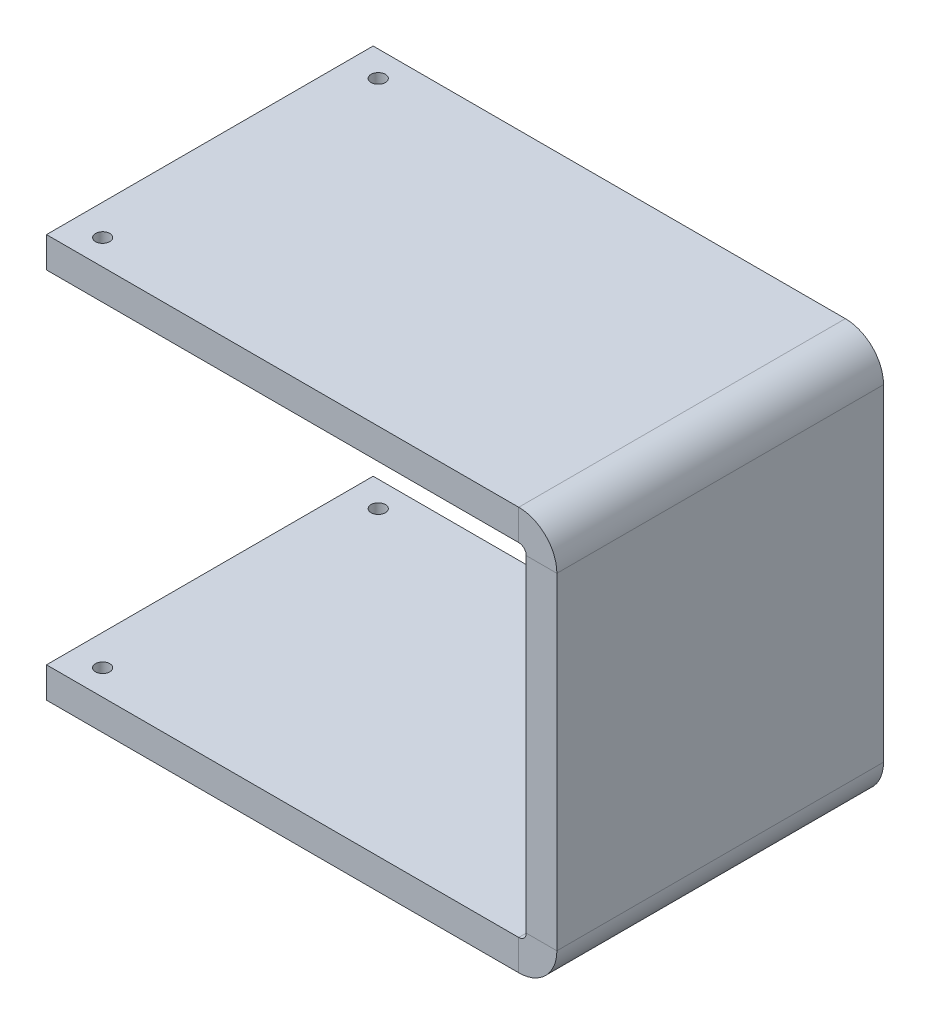
ISO-10303-21;
HEADER;
FILE_DESCRIPTION(('STEP AP214'),'2;1');
FILE_NAME('part.step','',(''),(''),'','','');
FILE_SCHEMA(('AUTOMOTIVE_DESIGN { 1 0 10303 214 1 1 1 1 }'));
ENDSEC;
DATA;
#1=APPLICATION_CONTEXT('core data for automotive mechanical design processes');
#2=APPLICATION_PROTOCOL_DEFINITION('international standard','automotive_design',2000,#1);
#3=PRODUCT_CONTEXT('',#1,'mechanical');
#4=PRODUCT('Part','Part','',(#3));
#5=PRODUCT_RELATED_PRODUCT_CATEGORY('part','',(#4));
#6=PRODUCT_DEFINITION_FORMATION('','',#4);
#7=PRODUCT_DEFINITION_CONTEXT('part definition',#1,'design');
#8=PRODUCT_DEFINITION('design','',#6,#7);
#9=PRODUCT_DEFINITION_SHAPE('','',#8);
#10=(LENGTH_UNIT() NAMED_UNIT(*) SI_UNIT(.MILLI.,.METRE.));
#11=(NAMED_UNIT(*) PLANE_ANGLE_UNIT() SI_UNIT($,.RADIAN.));
#12=(NAMED_UNIT(*) SI_UNIT($,.STERADIAN.) SOLID_ANGLE_UNIT());
#13=UNCERTAINTY_MEASURE_WITH_UNIT(LENGTH_MEASURE(1.E-05),#10,'distance_accuracy_value','');
#14=(GEOMETRIC_REPRESENTATION_CONTEXT(3) GLOBAL_UNCERTAINTY_ASSIGNED_CONTEXT((#13)) GLOBAL_UNIT_ASSIGNED_CONTEXT((#10,
#11,#12)) REPRESENTATION_CONTEXT('',''));
#15=CARTESIAN_POINT('',(0.,0.,0.));
#16=DIRECTION('',(0.,0.,1.));
#17=DIRECTION('',(1.,0.,0.));
#18=AXIS2_PLACEMENT_3D('',#15,#16,#17);
#19=CARTESIAN_POINT('',(0.,16.0134,32.));
#20=DIRECTION('',(0.,0.,1.));
#21=DIRECTION('',(1.,0.,0.));
#22=AXIS2_PLACEMENT_3D('',#19,#20,#21);
#23=PLANE('',#22);
#24=DIRECTION('',(-1.,0.,0.));
#25=VECTOR('',#24,1.);
#26=CARTESIAN_POINT('',(0.,16.0134,32.));
#27=LINE('',#26,#25);
#28=CARTESIAN_POINT('',(0.,16.0134,32.));
#29=VERTEX_POINT('',#28);
#30=CARTESIAN_POINT('',(-3.,16.0134,32.));
#31=VERTEX_POINT('',#30);
#32=EDGE_CURVE('E11',#29,#31,#27,.T.);
#33=ORIENTED_EDGE('',*,*,#32,.F.);
#34=CARTESIAN_POINT('',(-3.73659999999999,16.0134,32.));
#35=DIRECTION('',(0.,0.,1.));
#36=DIRECTION('',(1.,0.,0.));
#37=AXIS2_PLACEMENT_3D('',#34,#35,#36);
#38=CIRCLE('',#37,3.7366);
#39=CARTESIAN_POINT('',(-3.73659999999999,19.75,32.));
#40=VERTEX_POINT('',#39);
#41=EDGE_CURVE('E273',#40,#29,#38,.F.);
#42=ORIENTED_EDGE('',*,*,#41,.F.);
#43=DIRECTION('',(0.,1.,0.));
#44=VECTOR('',#43,1.);
#45=CARTESIAN_POINT('',(-3.73659999999999,16.75,32.));
#46=LINE('',#45,#44);
#47=CARTESIAN_POINT('',(-3.73659999999999,16.75,32.));
#48=VERTEX_POINT('',#47);
#49=EDGE_CURVE('E46',#48,#40,#46,.T.);
#50=ORIENTED_EDGE('',*,*,#49,.F.);
#51=CARTESIAN_POINT('',(-3.73659999999999,16.0134,32.));
#52=DIRECTION('',(0.,0.,1.));
#53=DIRECTION('',(1.,0.,0.));
#54=AXIS2_PLACEMENT_3D('',#51,#52,#53);
#55=CIRCLE('',#54,0.7366);
#56=EDGE_CURVE('E148',#48,#31,#55,.F.);
#57=ORIENTED_EDGE('',*,*,#56,.T.);
#58=EDGE_LOOP('',(#33,#42,#50,#57));
#59=FACE_BOUND('',#58,.T.);
#60=ADVANCED_FACE('F37',(#59),#23,.T.);
#61=CARTESIAN_POINT('',(-3.73659999999999,16.75,32.));
#62=DIRECTION('',(0.,0.,1.));
#63=DIRECTION('',(1.,0.,0.));
#64=AXIS2_PLACEMENT_3D('',#61,#62,#63);
#65=PLANE('',#64);
#66=DIRECTION('',(0.,-1.,0.));
#67=VECTOR('',#66,1.);
#68=CARTESIAN_POINT('',(0.,19.75,32.));
#69=LINE('',#68,#67);
#70=CARTESIAN_POINT('',(0.,-16.0134,32.));
#71=VERTEX_POINT('',#70);
#72=EDGE_CURVE('E142',#29,#71,#69,.T.);
#73=ORIENTED_EDGE('',*,*,#72,.F.);
#74=ORIENTED_EDGE('',*,*,#32,.T.);
#75=DIRECTION('',(0.,1.,0.));
#76=VECTOR('',#75,1.);
#77=CARTESIAN_POINT('',(-3.,19.75,32.));
#78=LINE('',#77,#76);
#79=CARTESIAN_POINT('',(-3.,-16.0134,32.));
#80=VERTEX_POINT('',#79);
#81=EDGE_CURVE('E139',#31,#80,#78,.F.);
#82=ORIENTED_EDGE('',*,*,#81,.T.);
#83=DIRECTION('',(1.,0.,0.));
#84=VECTOR('',#83,1.);
#85=CARTESIAN_POINT('',(-3.,-16.0134,32.));
#86=LINE('',#85,#84);
#87=EDGE_CURVE('E231',#80,#71,#86,.T.);
#88=ORIENTED_EDGE('',*,*,#87,.T.);
#89=EDGE_LOOP('',(#73,#74,#82,#88));
#90=FACE_BOUND('',#89,.T.);
#91=ADVANCED_FACE('F137',(#90),#65,.T.);
#92=CARTESIAN_POINT('',(-3.73659999999999,19.75,0.));
#93=DIRECTION('',(0.,0.,-1.));
#94=DIRECTION('',(-1.,0.,0.));
#95=AXIS2_PLACEMENT_3D('',#92,#93,#94);
#96=PLANE('',#95);
#97=DIRECTION('',(0.,-1.,0.));
#98=VECTOR('',#97,1.);
#99=CARTESIAN_POINT('',(-3.73659999999999,19.75,0.));
#100=LINE('',#99,#98);
#101=CARTESIAN_POINT('',(-3.73659999999999,19.75,0.));
#102=VERTEX_POINT('',#101);
#103=CARTESIAN_POINT('',(-3.73659999999999,16.75,0.));
#104=VERTEX_POINT('',#103);
#105=EDGE_CURVE('E236',#102,#104,#100,.T.);
#106=ORIENTED_EDGE('',*,*,#105,.F.);
#107=CARTESIAN_POINT('',(-3.73659999999999,16.0134,0.));
#108=DIRECTION('',(0.,0.,1.));
#109=DIRECTION('',(1.,0.,0.));
#110=AXIS2_PLACEMENT_3D('',#107,#108,#109);
#111=CIRCLE('',#110,3.7366);
#112=CARTESIAN_POINT('',(0.,16.0134,0.));
#113=VERTEX_POINT('',#112);
#114=EDGE_CURVE('E188',#102,#113,#111,.F.);
#115=ORIENTED_EDGE('',*,*,#114,.T.);
#116=DIRECTION('',(1.,0.,0.));
#117=VECTOR('',#116,1.);
#118=CARTESIAN_POINT('',(-3.,16.0134,0.));
#119=LINE('',#118,#117);
#120=CARTESIAN_POINT('',(-3.,16.0134,0.));
#121=VERTEX_POINT('',#120);
#122=EDGE_CURVE('E234',#121,#113,#119,.T.);
#123=ORIENTED_EDGE('',*,*,#122,.F.);
#124=CARTESIAN_POINT('',(-3.73659999999999,16.0134,0.));
#125=DIRECTION('',(0.,0.,1.));
#126=DIRECTION('',(1.,0.,0.));
#127=AXIS2_PLACEMENT_3D('',#124,#125,#126);
#128=CIRCLE('',#127,0.7366);
#129=EDGE_CURVE('E160',#104,#121,#128,.F.);
#130=ORIENTED_EDGE('',*,*,#129,.F.);
#131=EDGE_LOOP('',(#106,#115,#123,#130));
#132=FACE_BOUND('',#131,.T.);
#133=ADVANCED_FACE('F291',(#132),#96,.T.);
#134=CARTESIAN_POINT('',(-3.,16.0134,0.));
#135=DIRECTION('',(0.,0.,-1.));
#136=DIRECTION('',(-1.,0.,0.));
#137=AXIS2_PLACEMENT_3D('',#134,#135,#136);
#138=PLANE('',#137);
#139=DIRECTION('',(1.,0.,0.));
#140=VECTOR('',#139,1.);
#141=CARTESIAN_POINT('',(-50.,19.75,0.));
#142=LINE('',#141,#140);
#143=CARTESIAN_POINT('',(-50.,19.75,0.));
#144=VERTEX_POINT('',#143);
#145=EDGE_CURVE('E191',#144,#102,#142,.T.);
#146=ORIENTED_EDGE('',*,*,#145,.T.);
#147=ORIENTED_EDGE('',*,*,#105,.T.);
#148=DIRECTION('',(1.,0.,0.));
#149=VECTOR('',#148,1.);
#150=CARTESIAN_POINT('',(-50.,16.75,0.));
#151=LINE('',#150,#149);
#152=CARTESIAN_POINT('',(-50.,16.75,0.));
#153=VERTEX_POINT('',#152);
#154=EDGE_CURVE('E197',#153,#104,#151,.T.);
#155=ORIENTED_EDGE('',*,*,#154,.F.);
#156=DIRECTION('',(0.,1.,0.));
#157=VECTOR('',#156,1.);
#158=CARTESIAN_POINT('',(-50.,16.75,0.));
#159=LINE('',#158,#157);
#160=EDGE_CURVE('E194',#153,#144,#159,.T.);
#161=ORIENTED_EDGE('',*,*,#160,.T.);
#162=EDGE_LOOP('',(#146,#147,#155,#161));
#163=FACE_BOUND('',#162,.T.);
#164=ADVANCED_FACE('F337',(#163),#138,.T.);
#165=CARTESIAN_POINT('',(-3.7366,-19.75,32.));
#166=DIRECTION('',(0.,0.,1.));
#167=DIRECTION('',(1.,0.,0.));
#168=AXIS2_PLACEMENT_3D('',#165,#166,#167);
#169=PLANE('',#168);
#170=DIRECTION('',(0.,1.,0.));
#171=VECTOR('',#170,1.);
#172=CARTESIAN_POINT('',(-3.7366,-19.75,32.));
#173=LINE('',#172,#171);
#174=CARTESIAN_POINT('',(-3.7366,-19.75,32.));
#175=VERTEX_POINT('',#174);
#176=CARTESIAN_POINT('',(-3.7366,-16.75,32.));
#177=VERTEX_POINT('',#176);
#178=EDGE_CURVE('E55',#175,#177,#173,.T.);
#179=ORIENTED_EDGE('',*,*,#178,.F.);
#180=CARTESIAN_POINT('',(-3.7366,-16.0134,32.));
#181=DIRECTION('',(0.,0.,1.));
#182=DIRECTION('',(1.,0.,0.));
#183=AXIS2_PLACEMENT_3D('',#180,#181,#182);
#184=CIRCLE('',#183,3.7366);
#185=EDGE_CURVE('E269',#71,#175,#184,.F.);
#186=ORIENTED_EDGE('',*,*,#185,.F.);
#187=ORIENTED_EDGE('',*,*,#87,.F.);
#188=CARTESIAN_POINT('',(-3.7366,-16.0134,32.));
#189=DIRECTION('',(0.,0.,1.));
#190=DIRECTION('',(1.,0.,0.));
#191=AXIS2_PLACEMENT_3D('',#188,#189,#190);
#192=CIRCLE('',#191,0.7366);
#193=EDGE_CURVE('E168',#80,#177,#192,.F.);
#194=ORIENTED_EDGE('',*,*,#193,.T.);
#195=EDGE_LOOP('',(#179,#186,#187,#194));
#196=FACE_BOUND('',#195,.T.);
#197=ADVANCED_FACE('F342',(#196),#169,.T.);
#198=CARTESIAN_POINT('',(-3.,-16.0134,32.));
#199=DIRECTION('',(0.,0.,1.));
#200=DIRECTION('',(1.,0.,0.));
#201=AXIS2_PLACEMENT_3D('',#198,#199,#200);
#202=PLANE('',#201);
#203=DIRECTION('',(-1.,0.,0.));
#204=VECTOR('',#203,1.);
#205=CARTESIAN_POINT('',(0.,-19.75,32.));
#206=LINE('',#205,#204);
#207=CARTESIAN_POINT('',(-50.,-19.75,32.));
#208=VERTEX_POINT('',#207);
#209=EDGE_CURVE('E266',#175,#208,#206,.T.);
#210=ORIENTED_EDGE('',*,*,#209,.F.);
#211=ORIENTED_EDGE('',*,*,#178,.T.);
#212=DIRECTION('',(-1.,0.,0.));
#213=VECTOR('',#212,1.);
#214=CARTESIAN_POINT('',(0.,-16.75,32.));
#215=LINE('',#214,#213);
#216=CARTESIAN_POINT('',(-50.,-16.75,32.));
#217=VERTEX_POINT('',#216);
#218=EDGE_CURVE('E109',#177,#217,#215,.T.);
#219=ORIENTED_EDGE('',*,*,#218,.T.);
#220=DIRECTION('',(0.,1.,0.));
#221=VECTOR('',#220,1.);
#222=CARTESIAN_POINT('',(-50.,-19.75,32.));
#223=LINE('',#222,#221);
#224=EDGE_CURVE('E263',#208,#217,#223,.T.);
#225=ORIENTED_EDGE('',*,*,#224,.F.);
#226=EDGE_LOOP('',(#210,#211,#219,#225));
#227=FACE_BOUND('',#226,.T.);
#228=ADVANCED_FACE('F318',(#227),#202,.T.);
#229=CARTESIAN_POINT('',(0.,-16.0134,0.));
#230=DIRECTION('',(0.,0.,-1.));
#231=DIRECTION('',(-1.,0.,0.));
#232=AXIS2_PLACEMENT_3D('',#229,#230,#231);
#233=PLANE('',#232);
#234=DIRECTION('',(-1.,0.,0.));
#235=VECTOR('',#234,1.);
#236=CARTESIAN_POINT('',(0.,-16.0134,0.));
#237=LINE('',#236,#235);
#238=CARTESIAN_POINT('',(0.,-16.0134,0.));
#239=VERTEX_POINT('',#238);
#240=CARTESIAN_POINT('',(-3.,-16.0134,0.));
#241=VERTEX_POINT('',#240);
#242=EDGE_CURVE('E96',#239,#241,#237,.T.);
#243=ORIENTED_EDGE('',*,*,#242,.F.);
#244=CARTESIAN_POINT('',(-3.7366,-16.0134,0.));
#245=DIRECTION('',(0.,0.,1.));
#246=DIRECTION('',(1.,0.,0.));
#247=AXIS2_PLACEMENT_3D('',#244,#245,#246);
#248=CIRCLE('',#247,3.7366);
#249=CARTESIAN_POINT('',(-3.7366,-19.75,0.));
#250=VERTEX_POINT('',#249);
#251=EDGE_CURVE('E184',#239,#250,#248,.F.);
#252=ORIENTED_EDGE('',*,*,#251,.T.);
#253=DIRECTION('',(0.,-1.,0.));
#254=VECTOR('',#253,1.);
#255=CARTESIAN_POINT('',(-3.7366,-16.75,0.));
#256=LINE('',#255,#254);
#257=CARTESIAN_POINT('',(-3.7366,-16.75,0.));
#258=VERTEX_POINT('',#257);
#259=EDGE_CURVE('E103',#258,#250,#256,.T.);
#260=ORIENTED_EDGE('',*,*,#259,.F.);
#261=CARTESIAN_POINT('',(-3.7366,-16.0134,0.));
#262=DIRECTION('',(0.,0.,1.));
#263=DIRECTION('',(1.,0.,0.));
#264=AXIS2_PLACEMENT_3D('',#261,#262,#263);
#265=CIRCLE('',#264,0.7366);
#266=EDGE_CURVE('E203',#241,#258,#265,.F.);
#267=ORIENTED_EDGE('',*,*,#266,.F.);
#268=EDGE_LOOP('',(#243,#252,#260,#267));
#269=FACE_BOUND('',#268,.T.);
#270=ADVANCED_FACE('F306',(#269),#233,.T.);
#271=CARTESIAN_POINT('',(-3.7366,-16.75,0.));
#272=DIRECTION('',(0.,0.,-1.));
#273=DIRECTION('',(-1.,0.,0.));
#274=AXIS2_PLACEMENT_3D('',#271,#272,#273);
#275=PLANE('',#274);
#276=DIRECTION('',(0.,-1.,0.));
#277=VECTOR('',#276,1.);
#278=CARTESIAN_POINT('',(0.,19.75,0.));
#279=LINE('',#278,#277);
#280=EDGE_CURVE('E186',#113,#239,#279,.T.);
#281=ORIENTED_EDGE('',*,*,#280,.T.);
#282=ORIENTED_EDGE('',*,*,#242,.T.);
#283=DIRECTION('',(0.,1.,0.));
#284=VECTOR('',#283,1.);
#285=CARTESIAN_POINT('',(-3.,19.75,0.));
#286=LINE('',#285,#284);
#287=EDGE_CURVE('E201',#121,#241,#286,.F.);
#288=ORIENTED_EDGE('',*,*,#287,.F.);
#289=ORIENTED_EDGE('',*,*,#122,.T.);
#290=EDGE_LOOP('',(#281,#282,#288,#289));
#291=FACE_BOUND('',#290,.T.);
#292=ADVANCED_FACE('F293',(#291),#275,.T.);
#293=CARTESIAN_POINT('',(0.,-16.75,32.));
#294=DIRECTION('',(0.,-1.,0.));
#295=DIRECTION('',(1.,0.,0.));
#296=AXIS2_PLACEMENT_3D('',#293,#294,#295);
#297=PLANE('',#296);
#298=CARTESIAN_POINT('',(-47.,-16.75,2.5));
#299=DIRECTION('',(0.,-1.,0.));
#300=DIRECTION('',(1.,0.,0.));
#301=AXIS2_PLACEMENT_3D('',#298,#299,#300);
#302=CIRCLE('',#301,0.700000000000001);
#303=CARTESIAN_POINT('',(-46.3,-16.75,2.5));
#304=VERTEX_POINT('',#303);
#305=EDGE_CURVE('E178',#304,#304,#302,.T.);
#306=ORIENTED_EDGE('',*,*,#305,.T.);
#307=EDGE_LOOP('',(#306));
#308=FACE_BOUND('',#307,.T.);
#309=CARTESIAN_POINT('',(-47.,-16.75,29.5));
#310=DIRECTION('',(0.,-1.,0.));
#311=DIRECTION('',(1.,0.,0.));
#312=AXIS2_PLACEMENT_3D('',#309,#310,#311);
#313=CIRCLE('',#312,0.700000000000001);
#314=CARTESIAN_POINT('',(-46.3,-16.75,29.5));
#315=VERTEX_POINT('',#314);
#316=EDGE_CURVE('E240',#315,#315,#313,.T.);
#317=ORIENTED_EDGE('',*,*,#316,.T.);
#318=EDGE_LOOP('',(#317));
#319=FACE_BOUND('',#318,.T.);
#320=DIRECTION('',(-1.,0.,0.));
#321=VECTOR('',#320,1.);
#322=CARTESIAN_POINT('',(0.,-16.75,0.));
#323=LINE('',#322,#321);
#324=CARTESIAN_POINT('',(-50.,-16.75,0.));
#325=VERTEX_POINT('',#324);
#326=EDGE_CURVE('E174',#258,#325,#323,.T.);
#327=ORIENTED_EDGE('',*,*,#326,.T.);
#328=DIRECTION('',(0.,0.,-1.));
#329=VECTOR('',#328,1.);
#330=CARTESIAN_POINT('',(-50.,-16.75,32.));
#331=LINE('',#330,#329);
#332=EDGE_CURVE('E227',#217,#325,#331,.T.);
#333=ORIENTED_EDGE('',*,*,#332,.F.);
#334=ORIENTED_EDGE('',*,*,#218,.F.);
#335=DIRECTION('',(0.,0.,-1.));
#336=VECTOR('',#335,1.);
#337=CARTESIAN_POINT('',(-3.7366,-16.75,32.));
#338=LINE('',#337,#336);
#339=EDGE_CURVE('E170',#177,#258,#338,.T.);
#340=ORIENTED_EDGE('',*,*,#339,.T.);
#341=EDGE_LOOP('',(#327,#333,#334,#340));
#342=FACE_BOUND('',#341,.T.);
#343=ADVANCED_FACE('F312',(#308,#319,#342),#297,.F.);
#344=CARTESIAN_POINT('',(-50.,-19.75,32.));
#345=DIRECTION('',(-1.,0.,0.));
#346=DIRECTION('',(0.,0.,1.));
#347=AXIS2_PLACEMENT_3D('',#344,#345,#346);
#348=PLANE('',#347);
#349=DIRECTION('',(0.,1.,0.));
#350=VECTOR('',#349,1.);
#351=CARTESIAN_POINT('',(-50.,-19.75,0.));
#352=LINE('',#351,#350);
#353=CARTESIAN_POINT('',(-50.,-19.75,0.));
#354=VERTEX_POINT('',#353);
#355=EDGE_CURVE('E177',#354,#325,#352,.T.);
#356=ORIENTED_EDGE('',*,*,#355,.F.);
#357=DIRECTION('',(0.,0.,-1.));
#358=VECTOR('',#357,1.);
#359=CARTESIAN_POINT('',(-50.,-19.75,32.));
#360=LINE('',#359,#358);
#361=EDGE_CURVE('E225',#208,#354,#360,.T.);
#362=ORIENTED_EDGE('',*,*,#361,.F.);
#363=ORIENTED_EDGE('',*,*,#224,.T.);
#364=ORIENTED_EDGE('',*,*,#332,.T.);
#365=EDGE_LOOP('',(#356,#362,#363,#364));
#366=FACE_BOUND('',#365,.T.);
#367=ADVANCED_FACE('F317',(#366),#348,.T.);
#368=CARTESIAN_POINT('',(0.,-19.75,32.));
#369=DIRECTION('',(0.,-1.,0.));
#370=DIRECTION('',(1.,0.,0.));
#371=AXIS2_PLACEMENT_3D('',#368,#369,#370);
#372=PLANE('',#371);
#373=CARTESIAN_POINT('',(-47.,-19.75,2.5));
#374=DIRECTION('',(0.,1.,0.));
#375=DIRECTION('',(0.,0.,1.));
#376=AXIS2_PLACEMENT_3D('',#373,#374,#375);
#377=CIRCLE('',#376,0.700000000000001);
#378=CARTESIAN_POINT('',(-47.,-19.75,3.2));
#379=VERTEX_POINT('',#378);
#380=EDGE_CURVE('E241',#379,#379,#377,.T.);
#381=ORIENTED_EDGE('',*,*,#380,.T.);
#382=EDGE_LOOP('',(#381));
#383=FACE_BOUND('',#382,.T.);
#384=CARTESIAN_POINT('',(-47.,-19.75,29.5));
#385=DIRECTION('',(0.,1.,0.));
#386=DIRECTION('',(0.,0.,-1.));
#387=AXIS2_PLACEMENT_3D('',#384,#385,#386);
#388=CIRCLE('',#387,0.700000000000001);
#389=CARTESIAN_POINT('',(-47.,-19.75,28.8));
#390=VERTEX_POINT('',#389);
#391=EDGE_CURVE('E252',#390,#390,#388,.T.);
#392=ORIENTED_EDGE('',*,*,#391,.T.);
#393=EDGE_LOOP('',(#392));
#394=FACE_BOUND('',#393,.T.);
#395=DIRECTION('',(-1.,0.,0.));
#396=VECTOR('',#395,1.);
#397=CARTESIAN_POINT('',(0.,-19.75,0.));
#398=LINE('',#397,#396);
#399=EDGE_CURVE('E181',#250,#354,#398,.T.);
#400=ORIENTED_EDGE('',*,*,#399,.F.);
#401=DIRECTION('',(0.,0.,-1.));
#402=VECTOR('',#401,1.);
#403=CARTESIAN_POINT('',(-3.7366,-19.75,32.));
#404=LINE('',#403,#402);
#405=EDGE_CURVE('E222',#175,#250,#404,.T.);
#406=ORIENTED_EDGE('',*,*,#405,.F.);
#407=ORIENTED_EDGE('',*,*,#209,.T.);
#408=ORIENTED_EDGE('',*,*,#361,.T.);
#409=EDGE_LOOP('',(#400,#406,#407,#408));
#410=FACE_BOUND('',#409,.T.);
#411=ADVANCED_FACE('F320',(#383,#394,#410),#372,.T.);
#412=CARTESIAN_POINT('',(-3.7366,-16.0134,32.));
#413=DIRECTION('',(0.,0.,-1.));
#414=DIRECTION('',(-1.,0.,0.));
#415=AXIS2_PLACEMENT_3D('',#412,#413,#414);
#416=CYLINDRICAL_SURFACE('',#415,3.7366);
#417=ORIENTED_EDGE('',*,*,#251,.F.);
#418=DIRECTION('',(0.,0.,-1.));
#419=VECTOR('',#418,1.);
#420=CARTESIAN_POINT('',(0.,-16.0134,32.));
#421=LINE('',#420,#419);
#422=EDGE_CURVE('E219',#71,#239,#421,.T.);
#423=ORIENTED_EDGE('',*,*,#422,.F.);
#424=ORIENTED_EDGE('',*,*,#185,.T.);
#425=ORIENTED_EDGE('',*,*,#405,.T.);
#426=EDGE_LOOP('',(#417,#423,#424,#425));
#427=FACE_BOUND('',#426,.T.);
#428=ADVANCED_FACE('F303',(#427),#416,.T.);
#429=CARTESIAN_POINT('',(0.,19.75,32.));
#430=DIRECTION('',(1.,0.,0.));
#431=DIRECTION('',(0.,0.,-1.));
#432=AXIS2_PLACEMENT_3D('',#429,#430,#431);
#433=PLANE('',#432);
#434=ORIENTED_EDGE('',*,*,#280,.F.);
#435=DIRECTION('',(0.,0.,-1.));
#436=VECTOR('',#435,1.);
#437=CARTESIAN_POINT('',(0.,16.0134,32.));
#438=LINE('',#437,#436);
#439=EDGE_CURVE('E216',#29,#113,#438,.T.);
#440=ORIENTED_EDGE('',*,*,#439,.F.);
#441=ORIENTED_EDGE('',*,*,#72,.T.);
#442=ORIENTED_EDGE('',*,*,#422,.T.);
#443=EDGE_LOOP('',(#434,#440,#441,#442));
#444=FACE_BOUND('',#443,.T.);
#445=ADVANCED_FACE('F298',(#444),#433,.T.);
#446=CARTESIAN_POINT('',(-3.73659999999999,16.0134,32.));
#447=DIRECTION('',(0.,0.,-1.));
#448=DIRECTION('',(-1.,0.,0.));
#449=AXIS2_PLACEMENT_3D('',#446,#447,#448);
#450=CYLINDRICAL_SURFACE('',#449,3.7366);
#451=ORIENTED_EDGE('',*,*,#114,.F.);
#452=DIRECTION('',(0.,0.,-1.));
#453=VECTOR('',#452,1.);
#454=CARTESIAN_POINT('',(-3.73659999999999,19.75,32.));
#455=LINE('',#454,#453);
#456=EDGE_CURVE('E213',#40,#102,#455,.T.);
#457=ORIENTED_EDGE('',*,*,#456,.F.);
#458=ORIENTED_EDGE('',*,*,#41,.T.);
#459=ORIENTED_EDGE('',*,*,#439,.T.);
#460=EDGE_LOOP('',(#451,#457,#458,#459));
#461=FACE_BOUND('',#460,.T.);
#462=ADVANCED_FACE('F296',(#461),#450,.T.);
#463=CARTESIAN_POINT('',(-50.,19.75,32.));
#464=DIRECTION('',(0.,1.,0.));
#465=DIRECTION('',(0.,0.,1.));
#466=AXIS2_PLACEMENT_3D('',#463,#464,#465);
#467=PLANE('',#466);
#468=CARTESIAN_POINT('',(-47.,19.75,2.5));
#469=DIRECTION('',(0.,1.,0.));
#470=DIRECTION('',(0.,0.,1.));
#471=AXIS2_PLACEMENT_3D('',#468,#469,#470);
#472=CIRCLE('',#471,0.700000000000001);
#473=CARTESIAN_POINT('',(-47.,19.75,3.2));
#474=VERTEX_POINT('',#473);
#475=EDGE_CURVE('E247',#474,#474,#472,.T.);
#476=ORIENTED_EDGE('',*,*,#475,.F.);
#477=EDGE_LOOP('',(#476));
#478=FACE_BOUND('',#477,.T.);
#479=CARTESIAN_POINT('',(-47.,19.75,29.5));
#480=DIRECTION('',(0.,1.,0.));
#481=DIRECTION('',(0.,0.,-1.));
#482=AXIS2_PLACEMENT_3D('',#479,#480,#481);
#483=CIRCLE('',#482,0.700000000000001);
#484=CARTESIAN_POINT('',(-47.,19.75,28.8));
#485=VERTEX_POINT('',#484);
#486=EDGE_CURVE('E257',#485,#485,#483,.T.);
#487=ORIENTED_EDGE('',*,*,#486,.F.);
#488=EDGE_LOOP('',(#487));
#489=FACE_BOUND('',#488,.T.);
#490=ORIENTED_EDGE('',*,*,#145,.F.);
#491=DIRECTION('',(0.,0.,-1.));
#492=VECTOR('',#491,1.);
#493=CARTESIAN_POINT('',(-50.,19.75,32.));
#494=LINE('',#493,#492);
#495=CARTESIAN_POINT('',(-50.,19.75,32.));
#496=VERTEX_POINT('',#495);
#497=EDGE_CURVE('E211',#496,#144,#494,.T.);
#498=ORIENTED_EDGE('',*,*,#497,.F.);
#499=DIRECTION('',(1.,0.,0.));
#500=VECTOR('',#499,1.);
#501=CARTESIAN_POINT('',(-50.,19.75,32.));
#502=LINE('',#501,#500);
#503=EDGE_CURVE('E275',#496,#40,#502,.T.);
#504=ORIENTED_EDGE('',*,*,#503,.T.);
#505=ORIENTED_EDGE('',*,*,#456,.T.);
#506=EDGE_LOOP('',(#490,#498,#504,#505));
#507=FACE_BOUND('',#506,.T.);
#508=ADVANCED_FACE('F386',(#478,#489,#507),#467,.T.);
#509=CARTESIAN_POINT('',(-50.,16.75,32.));
#510=DIRECTION('',(-1.,0.,0.));
#511=DIRECTION('',(0.,0.,1.));
#512=AXIS2_PLACEMENT_3D('',#509,#510,#511);
#513=PLANE('',#512);
#514=ORIENTED_EDGE('',*,*,#160,.F.);
#515=DIRECTION('',(0.,0.,-1.));
#516=VECTOR('',#515,1.);
#517=CARTESIAN_POINT('',(-50.,16.75,32.));
#518=LINE('',#517,#516);
#519=CARTESIAN_POINT('',(-50.,16.75,32.));
#520=VERTEX_POINT('',#519);
#521=EDGE_CURVE('E209',#520,#153,#518,.T.);
#522=ORIENTED_EDGE('',*,*,#521,.F.);
#523=DIRECTION('',(0.,1.,0.));
#524=VECTOR('',#523,1.);
#525=CARTESIAN_POINT('',(-50.,16.75,32.));
#526=LINE('',#525,#524);
#527=EDGE_CURVE('E278',#520,#496,#526,.T.);
#528=ORIENTED_EDGE('',*,*,#527,.T.);
#529=ORIENTED_EDGE('',*,*,#497,.T.);
#530=EDGE_LOOP('',(#514,#522,#528,#529));
#531=FACE_BOUND('',#530,.T.);
#532=ADVANCED_FACE('F389',(#531),#513,.T.);
#533=CARTESIAN_POINT('',(-50.,16.75,32.));
#534=DIRECTION('',(0.,1.,0.));
#535=DIRECTION('',(0.,0.,1.));
#536=AXIS2_PLACEMENT_3D('',#533,#534,#535);
#537=PLANE('',#536);
#538=CARTESIAN_POINT('',(-47.,16.75,2.5));
#539=DIRECTION('',(0.,1.,0.));
#540=DIRECTION('',(0.,0.,1.));
#541=AXIS2_PLACEMENT_3D('',#538,#539,#540);
#542=CIRCLE('',#541,0.700000000000001);
#543=CARTESIAN_POINT('',(-47.,16.75,3.2));
#544=VERTEX_POINT('',#543);
#545=EDGE_CURVE('E40',#544,#544,#542,.T.);
#546=ORIENTED_EDGE('',*,*,#545,.T.);
#547=EDGE_LOOP('',(#546));
#548=FACE_BOUND('',#547,.T.);
#549=CARTESIAN_POINT('',(-47.,16.75,29.5));
#550=DIRECTION('',(0.,1.,0.));
#551=DIRECTION('',(0.,0.,1.));
#552=AXIS2_PLACEMENT_3D('',#549,#550,#551);
#553=CIRCLE('',#552,0.700000000000001);
#554=CARTESIAN_POINT('',(-47.,16.75,30.2));
#555=VERTEX_POINT('',#554);
#556=EDGE_CURVE('E238',#555,#555,#553,.T.);
#557=ORIENTED_EDGE('',*,*,#556,.T.);
#558=EDGE_LOOP('',(#557));
#559=FACE_BOUND('',#558,.T.);
#560=ORIENTED_EDGE('',*,*,#154,.T.);
#561=DIRECTION('',(0.,0.,-1.));
#562=VECTOR('',#561,1.);
#563=CARTESIAN_POINT('',(-3.73659999999999,16.75,32.));
#564=LINE('',#563,#562);
#565=EDGE_CURVE('E162',#48,#104,#564,.T.);
#566=ORIENTED_EDGE('',*,*,#565,.F.);
#567=DIRECTION('',(1.,0.,0.));
#568=VECTOR('',#567,1.);
#569=CARTESIAN_POINT('',(-50.,16.75,32.));
#570=LINE('',#569,#568);
#571=EDGE_CURVE('E153',#520,#48,#570,.T.);
#572=ORIENTED_EDGE('',*,*,#571,.F.);
#573=ORIENTED_EDGE('',*,*,#521,.T.);
#574=EDGE_LOOP('',(#560,#566,#572,#573));
#575=FACE_BOUND('',#574,.T.);
#576=ADVANCED_FACE('F288',(#548,#559,#575),#537,.F.);
#577=CARTESIAN_POINT('',(-3.73659999999999,16.0134,32.));
#578=DIRECTION('',(0.,0.,-1.));
#579=DIRECTION('',(-1.,0.,0.));
#580=AXIS2_PLACEMENT_3D('',#577,#578,#579);
#581=CYLINDRICAL_SURFACE('',#580,0.7366);
#582=ORIENTED_EDGE('',*,*,#129,.T.);
#583=DIRECTION('',(0.,0.,-1.));
#584=VECTOR('',#583,1.);
#585=CARTESIAN_POINT('',(-3.,16.0134,32.));
#586=LINE('',#585,#584);
#587=EDGE_CURVE('E157',#31,#121,#586,.T.);
#588=ORIENTED_EDGE('',*,*,#587,.F.);
#589=ORIENTED_EDGE('',*,*,#56,.F.);
#590=ORIENTED_EDGE('',*,*,#565,.T.);
#591=EDGE_LOOP('',(#582,#588,#589,#590));
#592=FACE_BOUND('',#591,.T.);
#593=ADVANCED_FACE('F158',(#592),#581,.F.);
#594=CARTESIAN_POINT('',(-3.,19.75,32.));
#595=DIRECTION('',(1.,0.,0.));
#596=DIRECTION('',(0.,0.,-1.));
#597=AXIS2_PLACEMENT_3D('',#594,#595,#596);
#598=PLANE('',#597);
#599=ORIENTED_EDGE('',*,*,#287,.T.);
#600=DIRECTION('',(0.,0.,-1.));
#601=VECTOR('',#600,1.);
#602=CARTESIAN_POINT('',(-3.,-16.0134,32.));
#603=LINE('',#602,#601);
#604=EDGE_CURVE('E163',#80,#241,#603,.T.);
#605=ORIENTED_EDGE('',*,*,#604,.F.);
#606=ORIENTED_EDGE('',*,*,#81,.F.);
#607=ORIENTED_EDGE('',*,*,#587,.T.);
#608=EDGE_LOOP('',(#599,#605,#606,#607));
#609=FACE_BOUND('',#608,.T.);
#610=ADVANCED_FACE('F165',(#609),#598,.F.);
#611=CARTESIAN_POINT('',(-3.7366,-16.0134,32.));
#612=DIRECTION('',(0.,0.,-1.));
#613=DIRECTION('',(-1.,0.,0.));
#614=AXIS2_PLACEMENT_3D('',#611,#612,#613);
#615=CYLINDRICAL_SURFACE('',#614,0.7366);
#616=ORIENTED_EDGE('',*,*,#266,.T.);
#617=ORIENTED_EDGE('',*,*,#339,.F.);
#618=ORIENTED_EDGE('',*,*,#193,.F.);
#619=ORIENTED_EDGE('',*,*,#604,.T.);
#620=EDGE_LOOP('',(#616,#617,#618,#619));
#621=FACE_BOUND('',#620,.T.);
#622=ADVANCED_FACE('F309',(#621),#615,.F.);
#623=CARTESIAN_POINT('',(-3.7366,-16.0134,32.));
#624=DIRECTION('',(0.,0.,1.));
#625=DIRECTION('',(1.,0.,0.));
#626=AXIS2_PLACEMENT_3D('',#623,#624,#625);
#627=PLANE('',#626);
#628=ORIENTED_EDGE('',*,*,#571,.T.);
#629=ORIENTED_EDGE('',*,*,#49,.T.);
#630=ORIENTED_EDGE('',*,*,#503,.F.);
#631=ORIENTED_EDGE('',*,*,#527,.F.);
#632=EDGE_LOOP('',(#628,#629,#630,#631));
#633=FACE_BOUND('',#632,.T.);
#634=ADVANCED_FACE('F284',(#633),#627,.T.);
#635=CARTESIAN_POINT('',(-3.7366,-16.0134,0.));
#636=DIRECTION('',(0.,0.,1.));
#637=DIRECTION('',(1.,0.,0.));
#638=AXIS2_PLACEMENT_3D('',#635,#636,#637);
#639=PLANE('',#638);
#640=ORIENTED_EDGE('',*,*,#326,.F.);
#641=ORIENTED_EDGE('',*,*,#259,.T.);
#642=ORIENTED_EDGE('',*,*,#399,.T.);
#643=ORIENTED_EDGE('',*,*,#355,.T.);
#644=EDGE_LOOP('',(#640,#641,#642,#643));
#645=FACE_BOUND('',#644,.T.);
#646=ADVANCED_FACE('F314',(#645),#639,.F.);
#647=CARTESIAN_POINT('',(-47.,-19.75,29.5));
#648=DIRECTION('',(0.,1.,0.));
#649=DIRECTION('',(0.,0.,1.));
#650=AXIS2_PLACEMENT_3D('',#647,#648,#649);
#651=CYLINDRICAL_SURFACE('',#650,0.700000000000001);
#652=ORIENTED_EDGE('',*,*,#486,.T.);
#653=EDGE_LOOP('',(#652));
#654=FACE_BOUND('',#653,.T.);
#655=ORIENTED_EDGE('',*,*,#556,.F.);
#656=EDGE_LOOP('',(#655));
#657=FACE_BOUND('',#656,.T.);
#658=ADVANCED_FACE('F367',(#654,#657),#651,.F.);
#659=CARTESIAN_POINT('',(-47.,-19.75,2.5));
#660=DIRECTION('',(0.,1.,0.));
#661=DIRECTION('',(0.,0.,1.));
#662=AXIS2_PLACEMENT_3D('',#659,#660,#661);
#663=CYLINDRICAL_SURFACE('',#662,0.700000000000001);
#664=ORIENTED_EDGE('',*,*,#475,.T.);
#665=EDGE_LOOP('',(#664));
#666=FACE_BOUND('',#665,.T.);
#667=ORIENTED_EDGE('',*,*,#545,.F.);
#668=EDGE_LOOP('',(#667));
#669=FACE_BOUND('',#668,.T.);
#670=ADVANCED_FACE('F364',(#666,#669),#663,.F.);
#671=ORIENTED_EDGE('',*,*,#391,.F.);
#672=EDGE_LOOP('',(#671));
#673=FACE_BOUND('',#672,.T.);
#674=ORIENTED_EDGE('',*,*,#316,.F.);
#675=EDGE_LOOP('',(#674));
#676=FACE_BOUND('',#675,.T.);
#677=ADVANCED_FACE('F361',(#673,#676),#651,.F.);
#678=ORIENTED_EDGE('',*,*,#380,.F.);
#679=EDGE_LOOP('',(#678));
#680=FACE_BOUND('',#679,.T.);
#681=ORIENTED_EDGE('',*,*,#305,.F.);
#682=EDGE_LOOP('',(#681));
#683=FACE_BOUND('',#682,.T.);
#684=ADVANCED_FACE('F363',(#680,#683),#663,.F.);
#685=CLOSED_SHELL('',(#60,#91,#133,#164,#197,#228,#270,#292,#343,#367,#411,#428,#445,#462,#508,
#532,#576,#593,#610,#622,#634,#646,#658,#670,#677,#684));
#686=MANIFOLD_SOLID_BREP('B2',#685);
#687=ADVANCED_BREP_SHAPE_REPRESENTATION('',(#18,#686),#14);
#688=SHAPE_DEFINITION_REPRESENTATION(#9,#687);
ENDSEC;
END-ISO-10303-21;
